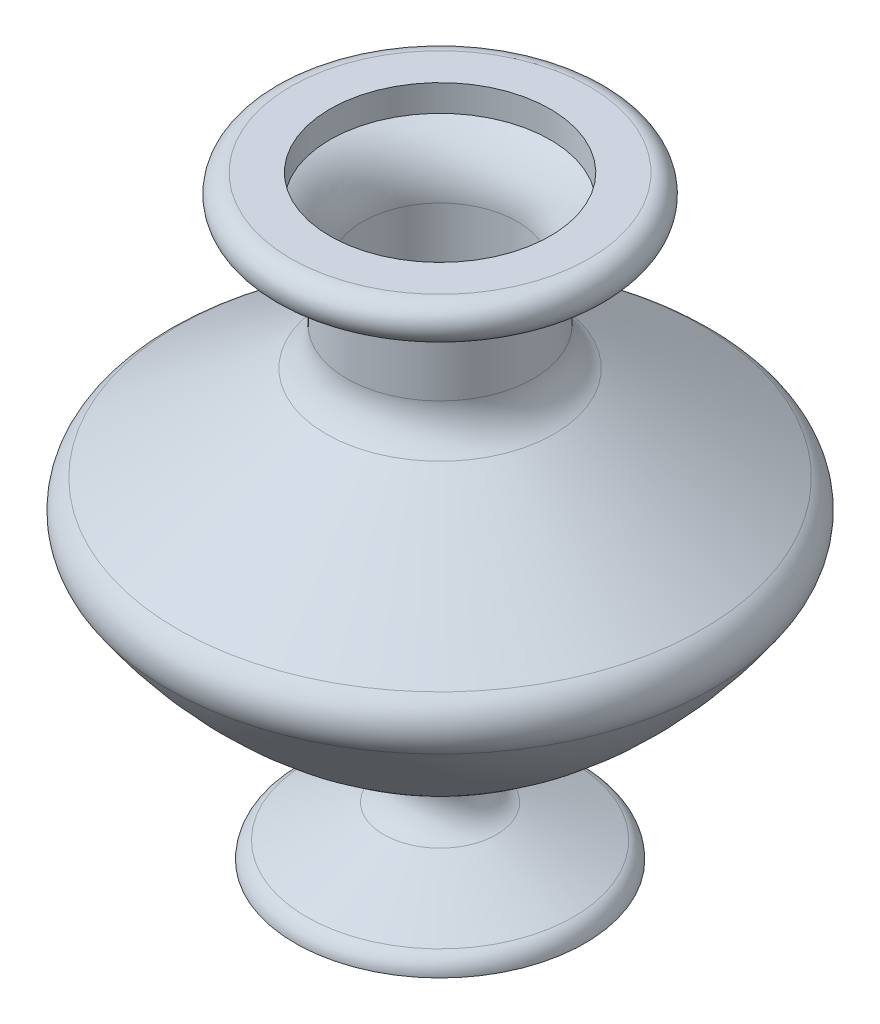
ISO-10303-21;
HEADER;
FILE_DESCRIPTION(('STEP AP214'),'2;1');
FILE_NAME('part.step','',(''),(''),'','','');
FILE_SCHEMA(('AUTOMOTIVE_DESIGN { 1 0 10303 214 1 1 1 1 }'));
ENDSEC;
DATA;
#1=APPLICATION_CONTEXT('core data for automotive mechanical design processes');
#2=APPLICATION_PROTOCOL_DEFINITION('international standard','automotive_design',2000,#1);
#3=PRODUCT_CONTEXT('',#1,'mechanical');
#4=PRODUCT('Part','Part','',(#3));
#5=PRODUCT_RELATED_PRODUCT_CATEGORY('part','',(#4));
#6=PRODUCT_DEFINITION_FORMATION('','',#4);
#7=PRODUCT_DEFINITION_CONTEXT('part definition',#1,'design');
#8=PRODUCT_DEFINITION('design','',#6,#7);
#9=PRODUCT_DEFINITION_SHAPE('','',#8);
#10=(LENGTH_UNIT() NAMED_UNIT(*) SI_UNIT(.MILLI.,.METRE.));
#11=(NAMED_UNIT(*) PLANE_ANGLE_UNIT() SI_UNIT($,.RADIAN.));
#12=(NAMED_UNIT(*) SI_UNIT($,.STERADIAN.) SOLID_ANGLE_UNIT());
#13=UNCERTAINTY_MEASURE_WITH_UNIT(LENGTH_MEASURE(1.E-05),#10,'distance_accuracy_value','');
#14=(GEOMETRIC_REPRESENTATION_CONTEXT(3) GLOBAL_UNCERTAINTY_ASSIGNED_CONTEXT((#13)) GLOBAL_UNIT_ASSIGNED_CONTEXT((#10,
#11,#12)) REPRESENTATION_CONTEXT('',''));
#15=CARTESIAN_POINT('',(0.,0.,0.));
#16=DIRECTION('',(0.,0.,1.));
#17=DIRECTION('',(1.,0.,0.));
#18=AXIS2_PLACEMENT_3D('',#15,#16,#17);
#19=CARTESIAN_POINT('',(0.,-80.,0.));
#20=DIRECTION('',(0.,-1.,0.));
#21=DIRECTION('',(1.,0.,0.));
#22=AXIS2_PLACEMENT_3D('',#19,#20,#21);
#23=PLANE('',#22);
#24=CARTESIAN_POINT('',(0.,-80.,0.));
#25=DIRECTION('',(0.,1.,0.));
#26=DIRECTION('',(-1.,0.,0.));
#27=AXIS2_PLACEMENT_3D('',#24,#25,#26);
#28=CIRCLE('',#27,38.905140273105);
#29=CARTESIAN_POINT('',(-38.9051402731049,-80.,0.));
#30=VERTEX_POINT('',#29);
#31=EDGE_CURVE('E10',#30,#30,#28,.T.);
#32=ORIENTED_EDGE('',*,*,#31,.F.);
#33=EDGE_LOOP('',(#32));
#34=FACE_BOUND('',#33,.T.);
#35=ADVANCED_FACE('F31',(#34),#23,.T.);
#36=CARTESIAN_POINT('',(0.,-79.9845651478144,0.));
#37=DIRECTION('',(0.,1.,0.));
#38=DIRECTION('',(-1.,0.,0.));
#39=AXIS2_PLACEMENT_3D('',#36,#37,#38);
#40=TOROIDAL_SURFACE('',#39,33.9051640966279,5.);
#41=ORIENTED_EDGE('',*,*,#31,.T.);
#42=EDGE_LOOP('',(#41));
#43=FACE_BOUND('',#42,.T.);
#44=CARTESIAN_POINT('',(0.,-75.3820478205228,0.));
#45=DIRECTION('',(0.,1.,0.));
#46=DIRECTION('',(-1.,0.,0.));
#47=AXIS2_PLACEMENT_3D('',#44,#45,#46);
#48=CIRCLE('',#47,35.8588360885397);
#49=CARTESIAN_POINT('',(-35.8588360885397,-75.3820478205229,0.));
#50=VERTEX_POINT('',#49);
#51=EDGE_CURVE('E37',#50,#50,#48,.T.);
#52=ORIENTED_EDGE('',*,*,#51,.F.);
#53=EDGE_LOOP('',(#52));
#54=FACE_BOUND('',#53,.T.);
#55=ADVANCED_FACE('F121',(#43,#54),#40,.T.);
#56=CARTESIAN_POINT('',(0.,-66.5845311891249,0.));
#57=DIRECTION('',(0.,-1.,0.));
#58=DIRECTION('',(1.,0.,0.));
#59=AXIS2_PLACEMENT_3D('',#56,#57,#58);
#60=CONICAL_SURFACE('',#59,15.1333904145588,1.16936704655124);
#61=ORIENTED_EDGE('',*,*,#51,.T.);
#62=EDGE_LOOP('',(#61));
#63=FACE_BOUND('',#62,.T.);
#64=CARTESIAN_POINT('',(0.,-66.5845311891249,0.));
#65=DIRECTION('',(0.,1.,0.));
#66=DIRECTION('',(-1.,0.,0.));
#67=AXIS2_PLACEMENT_3D('',#64,#65,#66);
#68=CIRCLE('',#67,15.1333904145588);
#69=CARTESIAN_POINT('',(-15.1333904145588,-66.5845311891249,0.));
#70=VERTEX_POINT('',#69);
#71=EDGE_CURVE('E41',#70,#70,#68,.T.);
#72=ORIENTED_EDGE('',*,*,#71,.F.);
#73=EDGE_LOOP('',(#72));
#74=FACE_BOUND('',#73,.T.);
#75=ADVANCED_FACE('F126',(#63,#74),#60,.T.);
#76=CARTESIAN_POINT('',(0.,-58.3,0.));
#77=DIRECTION('',(0.,1.,0.));
#78=DIRECTION('',(-1.,0.,0.));
#79=AXIS2_PLACEMENT_3D('',#76,#77,#78);
#80=TOROIDAL_SURFACE('',#79,18.65,9.00000000000002);
#81=ORIENTED_EDGE('',*,*,#71,.T.);
#82=EDGE_LOOP('',(#81));
#83=FACE_BOUND('',#82,.T.);
#84=CARTESIAN_POINT('',(0.,-49.9209340901695,0.));
#85=DIRECTION('',(0.,1.,0.));
#86=DIRECTION('',(-1.,0.,0.));
#87=AXIS2_PLACEMENT_3D('',#84,#85,#86);
#88=CIRCLE('',#87,15.3649955131359);
#89=CARTESIAN_POINT('',(-15.3649955131359,-49.9209340901695,0.));
#90=VERTEX_POINT('',#89);
#91=EDGE_CURVE('E45',#90,#90,#88,.T.);
#92=ORIENTED_EDGE('',*,*,#91,.F.);
#93=EDGE_LOOP('',(#92));
#94=FACE_BOUND('',#93,.T.);
#95=ADVANCED_FACE('F130',(#83,#94),#80,.F.);
#96=CARTESIAN_POINT('',(0.,66.2687798594792,0.));
#97=DIRECTION('',(0.,1.,0.));
#98=DIRECTION('',(-1.,0.,0.));
#99=AXIS2_PLACEMENT_3D('',#96,#97,#98);
#100=DEGENERATE_TOROIDAL_SURFACE('',#99,30.1870667047132,124.8,.F.);
#101=ORIENTED_EDGE('',*,*,#91,.T.);
#102=EDGE_LOOP('',(#101));
#103=FACE_BOUND('',#102,.T.);
#104=CARTESIAN_POINT('',(0.,-3.64161501498533,0.));
#105=DIRECTION('',(0.,1.,0.));
#106=DIRECTION('',(-1.,0.,0.));
#107=AXIS2_PLACEMENT_3D('',#104,#105,#106);
#108=CIRCLE('',#107,73.1936698398503);
#109=CARTESIAN_POINT('',(-73.1936698398503,-3.64161501498536,0.));
#110=VERTEX_POINT('',#109);
#111=EDGE_CURVE('E50',#110,#110,#108,.T.);
#112=ORIENTED_EDGE('',*,*,#111,.F.);
#113=EDGE_LOOP('',(#112));
#114=FACE_BOUND('',#113,.T.);
#115=ADVANCED_FACE('F136',(#103,#114),#100,.F.);
#116=CARTESIAN_POINT('',(0.,1.40000000000003,0.));
#117=DIRECTION('',(0.,1.,0.));
#118=DIRECTION('',(-1.,0.,0.));
#119=AXIS2_PLACEMENT_3D('',#116,#117,#118);
#120=TOROIDAL_SURFACE('',#119,65.7383282621173,8.99999999999998);
#121=ORIENTED_EDGE('',*,*,#111,.T.);
#122=EDGE_LOOP('',(#121));
#123=FACE_BOUND('',#122,.T.);
#124=CARTESIAN_POINT('',(0.,8.98837163590942,0.));
#125=DIRECTION('',(0.,1.,0.));
#126=DIRECTION('',(-1.,0.,0.));
#127=AXIS2_PLACEMENT_3D('',#124,#125,#126);
#128=CIRCLE('',#127,70.5774000651934);
#129=CARTESIAN_POINT('',(-70.5774000651934,8.9883716359094,0.));
#130=VERTEX_POINT('',#129);
#131=EDGE_CURVE('E53',#130,#130,#128,.T.);
#132=ORIENTED_EDGE('',*,*,#131,.F.);
#133=EDGE_LOOP('',(#132));
#134=FACE_BOUND('',#133,.T.);
#135=ADVANCED_FACE('F140',(#123,#134),#120,.T.);
#136=CARTESIAN_POINT('',(0.,34.4489706214393,0.));
#137=DIRECTION('',(0.,-1.,0.));
#138=DIRECTION('',(1.,0.,0.));
#139=AXIS2_PLACEMENT_3D('',#136,#137,#138);
#140=CONICAL_SURFACE('',#139,30.6514607451271,1.00311958027937);
#141=ORIENTED_EDGE('',*,*,#131,.T.);
#142=EDGE_LOOP('',(#141));
#143=FACE_BOUND('',#142,.T.);
#144=CARTESIAN_POINT('',(0.,34.4489706214393,0.));
#145=DIRECTION('',(0.,1.,0.));
#146=DIRECTION('',(-1.,0.,0.));
#147=AXIS2_PLACEMENT_3D('',#144,#145,#146);
#148=CIRCLE('',#147,30.6514607451271);
#149=CARTESIAN_POINT('',(-30.6514607451271,34.4489706214393,0.));
#150=VERTEX_POINT('',#149);
#151=EDGE_CURVE('E56',#150,#150,#148,.T.);
#152=ORIENTED_EDGE('',*,*,#151,.F.);
#153=EDGE_LOOP('',(#152));
#154=FACE_BOUND('',#153,.T.);
#155=ADVANCED_FACE('F144',(#143,#154),#140,.T.);
#156=CARTESIAN_POINT('',(0.,44.5667994693185,0.));
#157=DIRECTION('',(0.,1.,0.));
#158=DIRECTION('',(-1.,0.,0.));
#159=AXIS2_PLACEMENT_3D('',#156,#157,#158);
#160=TOROIDAL_SURFACE('',#159,37.1035564825618,12.);
#161=ORIENTED_EDGE('',*,*,#151,.T.);
#162=EDGE_LOOP('',(#161));
#163=FACE_BOUND('',#162,.T.);
#164=CARTESIAN_POINT('',(0.,44.5667994693185,0.));
#165=DIRECTION('',(0.,1.,0.));
#166=DIRECTION('',(-1.,0.,0.));
#167=AXIS2_PLACEMENT_3D('',#164,#165,#166);
#168=CIRCLE('',#167,25.1035564825618);
#169=CARTESIAN_POINT('',(-25.1035564825618,44.5667994693185,0.));
#170=VERTEX_POINT('',#169);
#171=EDGE_CURVE('E59',#170,#170,#168,.T.);
#172=ORIENTED_EDGE('',*,*,#171,.F.);
#173=EDGE_LOOP('',(#172));
#174=FACE_BOUND('',#173,.T.);
#175=ADVANCED_FACE('F148',(#163,#174),#160,.F.);
#176=CARTESIAN_POINT('',(0.,80.,0.));
#177=DIRECTION('',(0.,1.,0.));
#178=DIRECTION('',(-1.,0.,0.));
#179=AXIS2_PLACEMENT_3D('',#176,#177,#178);
#180=CYLINDRICAL_SURFACE('',#179,25.1035564825618);
#181=ORIENTED_EDGE('',*,*,#171,.T.);
#182=EDGE_LOOP('',(#181));
#183=FACE_BOUND('',#182,.T.);
#184=CARTESIAN_POINT('',(0.,58.2667994693185,0.));
#185=DIRECTION('',(0.,1.,0.));
#186=DIRECTION('',(-1.,0.,0.));
#187=AXIS2_PLACEMENT_3D('',#184,#185,#186);
#188=CIRCLE('',#187,25.1035564825618);
#189=CARTESIAN_POINT('',(-25.1035564825618,58.2667994693185,0.));
#190=VERTEX_POINT('',#189);
#191=EDGE_CURVE('E62',#190,#190,#188,.T.);
#192=ORIENTED_EDGE('',*,*,#191,.F.);
#193=EDGE_LOOP('',(#192));
#194=FACE_BOUND('',#193,.T.);
#195=ADVANCED_FACE('F152',(#183,#194),#180,.T.);
#196=CARTESIAN_POINT('',(0.,58.2667994693185,0.));
#197=DIRECTION('',(0.,1.,0.));
#198=DIRECTION('',(-1.,0.,0.));
#199=AXIS2_PLACEMENT_3D('',#196,#197,#198);
#200=TOROIDAL_SURFACE('',#199,37.1035564825618,12.);
#201=ORIENTED_EDGE('',*,*,#191,.T.);
#202=EDGE_LOOP('',(#201));
#203=FACE_BOUND('',#202,.T.);
#204=CARTESIAN_POINT('',(0.,70.0784704321525,0.));
#205=DIRECTION('',(0.,1.,0.));
#206=DIRECTION('',(-1.,0.,0.));
#207=AXIS2_PLACEMENT_3D('',#204,#205,#206);
#208=CIRCLE('',#207,39.2212035413854);
#209=CARTESIAN_POINT('',(-39.2212035413854,70.0784704321525,0.));
#210=VERTEX_POINT('',#209);
#211=EDGE_CURVE('E65',#210,#210,#208,.T.);
#212=ORIENTED_EDGE('',*,*,#211,.F.);
#213=EDGE_LOOP('',(#212));
#214=FACE_BOUND('',#213,.T.);
#215=ADVANCED_FACE('F156',(#203,#214),#200,.F.);
#216=CARTESIAN_POINT('',(0.,75.,0.));
#217=DIRECTION('',(0.,1.,0.));
#218=DIRECTION('',(-1.,0.,0.));
#219=AXIS2_PLACEMENT_3D('',#216,#217,#218);
#220=TOROIDAL_SURFACE('',#219,40.1035564825618,5.);
#221=ORIENTED_EDGE('',*,*,#211,.T.);
#222=EDGE_LOOP('',(#221));
#223=FACE_BOUND('',#222,.T.);
#224=CARTESIAN_POINT('',(0.,80.,0.));
#225=DIRECTION('',(0.,1.,0.));
#226=DIRECTION('',(-1.,0.,0.));
#227=AXIS2_PLACEMENT_3D('',#224,#225,#226);
#228=CIRCLE('',#227,40.1035564825618);
#229=CARTESIAN_POINT('',(-40.1035564825619,80.,0.));
#230=VERTEX_POINT('',#229);
#231=EDGE_CURVE('E68',#230,#230,#228,.T.);
#232=ORIENTED_EDGE('',*,*,#231,.F.);
#233=EDGE_LOOP('',(#232));
#234=FACE_BOUND('',#233,.T.);
#235=ADVANCED_FACE('F160',(#223,#234),#220,.T.);
#236=CARTESIAN_POINT('',(-40.1035564825619,80.,0.));
#237=DIRECTION('',(0.,1.,0.));
#238=DIRECTION('',(-1.,0.,0.));
#239=AXIS2_PLACEMENT_3D('',#236,#237,#238);
#240=PLANE('',#239);
#241=ORIENTED_EDGE('',*,*,#231,.T.);
#242=EDGE_LOOP('',(#241));
#243=FACE_BOUND('',#242,.T.);
#244=CARTESIAN_POINT('',(0.,80.,0.));
#245=DIRECTION('',(0.,1.,0.));
#246=DIRECTION('',(-1.,0.,0.));
#247=AXIS2_PLACEMENT_3D('',#244,#245,#246);
#248=CIRCLE('',#247,29.6035564825618);
#249=CARTESIAN_POINT('',(-29.6035564825619,80.,0.));
#250=VERTEX_POINT('',#249);
#251=EDGE_CURVE('E71',#250,#250,#248,.T.);
#252=ORIENTED_EDGE('',*,*,#251,.F.);
#253=EDGE_LOOP('',(#252));
#254=FACE_BOUND('',#253,.T.);
#255=ADVANCED_FACE('F164',(#243,#254),#240,.T.);
#256=CARTESIAN_POINT('',(0.,80.,0.));
#257=DIRECTION('',(0.,1.,0.));
#258=DIRECTION('',(-1.,0.,0.));
#259=AXIS2_PLACEMENT_3D('',#256,#257,#258);
#260=CYLINDRICAL_SURFACE('',#259,29.6035564825618);
#261=ORIENTED_EDGE('',*,*,#251,.T.);
#262=EDGE_LOOP('',(#261));
#263=FACE_BOUND('',#262,.T.);
#264=CARTESIAN_POINT('',(0.,72.8513803683365,0.));
#265=DIRECTION('',(0.,1.,0.));
#266=DIRECTION('',(-1.,0.,0.));
#267=AXIS2_PLACEMENT_3D('',#264,#265,#266);
#268=CIRCLE('',#267,29.6035564825618);
#269=CARTESIAN_POINT('',(-29.6035564825619,72.8513803683365,0.));
#270=VERTEX_POINT('',#269);
#271=EDGE_CURVE('E74',#270,#270,#268,.T.);
#272=ORIENTED_EDGE('',*,*,#271,.F.);
#273=EDGE_LOOP('',(#272));
#274=FACE_BOUND('',#273,.T.);
#275=ADVANCED_FACE('F168',(#263,#274),#260,.F.);
#276=CARTESIAN_POINT('',(0.,58.2667994693185,0.));
#277=DIRECTION('',(0.,1.,0.));
#278=DIRECTION('',(-1.,0.,0.));
#279=AXIS2_PLACEMENT_3D('',#276,#277,#278);
#280=TOROIDAL_SURFACE('',#279,37.1035564825618,16.4);
#281=ORIENTED_EDGE('',*,*,#271,.T.);
#282=EDGE_LOOP('',(#281));
#283=FACE_BOUND('',#282,.T.);
#284=CARTESIAN_POINT('',(0.,58.2667994693185,0.));
#285=DIRECTION('',(0.,1.,0.));
#286=DIRECTION('',(-1.,0.,0.));
#287=AXIS2_PLACEMENT_3D('',#284,#285,#286);
#288=CIRCLE('',#287,20.7035564825618);
#289=CARTESIAN_POINT('',(-20.7035564825619,58.2667994693185,0.));
#290=VERTEX_POINT('',#289);
#291=EDGE_CURVE('E77',#290,#290,#288,.T.);
#292=ORIENTED_EDGE('',*,*,#291,.F.);
#293=EDGE_LOOP('',(#292));
#294=FACE_BOUND('',#293,.T.);
#295=ADVANCED_FACE('F172',(#283,#294),#280,.T.);
#296=CARTESIAN_POINT('',(0.,80.,0.));
#297=DIRECTION('',(0.,1.,0.));
#298=DIRECTION('',(-1.,0.,0.));
#299=AXIS2_PLACEMENT_3D('',#296,#297,#298);
#300=CYLINDRICAL_SURFACE('',#299,20.7035564825618);
#301=ORIENTED_EDGE('',*,*,#291,.T.);
#302=EDGE_LOOP('',(#301));
#303=FACE_BOUND('',#302,.T.);
#304=CARTESIAN_POINT('',(0.,44.5667994693185,0.));
#305=DIRECTION('',(0.,1.,0.));
#306=DIRECTION('',(-1.,0.,0.));
#307=AXIS2_PLACEMENT_3D('',#304,#305,#306);
#308=CIRCLE('',#307,20.7035564825618);
#309=CARTESIAN_POINT('',(-20.7035564825619,44.5667994693185,0.));
#310=VERTEX_POINT('',#309);
#311=EDGE_CURVE('E80',#310,#310,#308,.T.);
#312=ORIENTED_EDGE('',*,*,#311,.F.);
#313=EDGE_LOOP('',(#312));
#314=FACE_BOUND('',#313,.T.);
#315=ADVANCED_FACE('F176',(#303,#314),#300,.F.);
#316=CARTESIAN_POINT('',(0.,44.5667994693185,0.));
#317=DIRECTION('',(0.,1.,0.));
#318=DIRECTION('',(-1.,0.,0.));
#319=AXIS2_PLACEMENT_3D('',#316,#317,#318);
#320=TOROIDAL_SURFACE('',#319,37.1035564825618,16.4);
#321=ORIENTED_EDGE('',*,*,#311,.T.);
#322=EDGE_LOOP('',(#321));
#323=FACE_BOUND('',#322,.T.);
#324=CARTESIAN_POINT('',(0.,30.7391000438836,0.));
#325=DIRECTION('',(0.,1.,0.));
#326=DIRECTION('',(-1.,0.,0.));
#327=AXIS2_PLACEMENT_3D('',#324,#325,#326);
#328=CIRCLE('',#327,28.2856923080677);
#329=CARTESIAN_POINT('',(-28.2856923080677,30.7391000438836,0.));
#330=VERTEX_POINT('',#329);
#331=EDGE_CURVE('E83',#330,#330,#328,.T.);
#332=ORIENTED_EDGE('',*,*,#331,.F.);
#333=EDGE_LOOP('',(#332));
#334=FACE_BOUND('',#333,.T.);
#335=ADVANCED_FACE('F180',(#323,#334),#320,.T.);
#336=CARTESIAN_POINT('',(0.,5.27850105835369,0.));
#337=DIRECTION('',(0.,-1.,0.));
#338=DIRECTION('',(1.,0.,0.));
#339=AXIS2_PLACEMENT_3D('',#336,#337,#338);
#340=CONICAL_SURFACE('',#339,68.211631628134,1.00311958027936);
#341=ORIENTED_EDGE('',*,*,#331,.T.);
#342=EDGE_LOOP('',(#341));
#343=FACE_BOUND('',#342,.T.);
#344=CARTESIAN_POINT('',(0.,5.27850105835369,0.));
#345=DIRECTION('',(0.,1.,0.));
#346=DIRECTION('',(-1.,0.,0.));
#347=AXIS2_PLACEMENT_3D('',#344,#345,#346);
#348=CIRCLE('',#347,68.211631628134);
#349=CARTESIAN_POINT('',(-68.211631628134,5.27850105835367,0.));
#350=VERTEX_POINT('',#349);
#351=EDGE_CURVE('E86',#350,#350,#348,.T.);
#352=ORIENTED_EDGE('',*,*,#351,.F.);
#353=EDGE_LOOP('',(#352));
#354=FACE_BOUND('',#353,.T.);
#355=ADVANCED_FACE('F184',(#343,#354),#340,.F.);
#356=CARTESIAN_POINT('',(0.,1.40000000000003,0.));
#357=DIRECTION('',(0.,1.,0.));
#358=DIRECTION('',(-1.,0.,0.));
#359=AXIS2_PLACEMENT_3D('',#356,#357,#358);
#360=TOROIDAL_SURFACE('',#359,65.7383282621173,4.59999999999998);
#361=ORIENTED_EDGE('',*,*,#351,.T.);
#362=EDGE_LOOP('',(#361));
#363=FACE_BOUND('',#362,.T.);
#364=CARTESIAN_POINT('',(0.,-1.17682545210362,0.));
#365=DIRECTION('',(0.,1.,0.));
#366=DIRECTION('',(-1.,0.,0.));
#367=AXIS2_PLACEMENT_3D('',#364,#365,#366);
#368=CIRCLE('',#367,69.5488361796253);
#369=CARTESIAN_POINT('',(-69.5488361796253,-1.17682545210365,0.));
#370=VERTEX_POINT('',#369);
#371=EDGE_CURVE('E89',#370,#370,#368,.T.);
#372=ORIENTED_EDGE('',*,*,#371,.F.);
#373=EDGE_LOOP('',(#372));
#374=FACE_BOUND('',#373,.T.);
#375=ADVANCED_FACE('F188',(#363,#374),#360,.F.);
#376=CARTESIAN_POINT('',(0.,66.2687798594792,0.));
#377=DIRECTION('',(0.,1.,0.));
#378=DIRECTION('',(-1.,0.,0.));
#379=AXIS2_PLACEMENT_3D('',#376,#377,#378);
#380=DEGENERATE_TOROIDAL_SURFACE('',#379,30.1870667047132,120.4,.F.);
#381=ORIENTED_EDGE('',*,*,#371,.T.);
#382=EDGE_LOOP('',(#381));
#383=FACE_BOUND('',#382,.T.);
#384=CARTESIAN_POINT('',(0.,-45.8245018675858,0.));
#385=DIRECTION('',(0.,1.,0.));
#386=DIRECTION('',(-1.,0.,0.));
#387=AXIS2_PLACEMENT_3D('',#384,#385,#386);
#388=CIRCLE('',#387,13.7589933195579);
#389=CARTESIAN_POINT('',(-13.7589933195579,-45.8245018675858,0.));
#390=VERTEX_POINT('',#389);
#391=EDGE_CURVE('E92',#390,#390,#388,.T.);
#392=ORIENTED_EDGE('',*,*,#391,.F.);
#393=EDGE_LOOP('',(#392));
#394=FACE_BOUND('',#393,.T.);
#395=ADVANCED_FACE('F192',(#383,#394),#380,.T.);
#396=CARTESIAN_POINT('',(0.,-58.3,0.));
#397=DIRECTION('',(0.,1.,0.));
#398=DIRECTION('',(-1.,0.,0.));
#399=AXIS2_PLACEMENT_3D('',#396,#397,#398);
#400=TOROIDAL_SURFACE('',#399,18.65,13.4);
#401=ORIENTED_EDGE('',*,*,#391,.T.);
#402=EDGE_LOOP('',(#401));
#403=FACE_BOUND('',#402,.T.);
#404=CARTESIAN_POINT('',(0.,-70.6347464371415,0.));
#405=DIRECTION('',(0.,1.,0.));
#406=DIRECTION('',(-1.,0.,0.));
#407=AXIS2_PLACEMENT_3D('',#404,#405,#406);
#408=CIRCLE('',#407,13.4141590616765);
#409=CARTESIAN_POINT('',(-13.4141590616765,-70.6347464371415,0.));
#410=VERTEX_POINT('',#409);
#411=EDGE_CURVE('E95',#410,#410,#408,.T.);
#412=ORIENTED_EDGE('',*,*,#411,.F.);
#413=EDGE_LOOP('',(#412));
#414=FACE_BOUND('',#413,.T.);
#415=ADVANCED_FACE('F117',(#403,#414),#400,.T.);
#416=CARTESIAN_POINT('',(0.,-75.3149973325402,0.));
#417=DIRECTION('',(0.,-1.,0.));
#418=DIRECTION('',(1.,0.,0.));
#419=AXIS2_PLACEMENT_3D('',#416,#417,#418);
#420=CONICAL_SURFACE('',#419,24.4400303089095,1.16936704655124);
#421=ORIENTED_EDGE('',*,*,#411,.T.);
#422=EDGE_LOOP('',(#421));
#423=FACE_BOUND('',#422,.T.);
#424=CARTESIAN_POINT('',(0.,-75.3149973325402,0.));
#425=DIRECTION('',(0.,1.,0.));
#426=DIRECTION('',(-1.,0.,0.));
#427=AXIS2_PLACEMENT_3D('',#424,#425,#426);
#428=CIRCLE('',#427,24.4400303089095);
#429=CARTESIAN_POINT('',(-24.4400303089095,-75.3149973325402,0.));
#430=VERTEX_POINT('',#429);
#431=EDGE_CURVE('E98',#430,#430,#428,.T.);
#432=ORIENTED_EDGE('',*,*,#431,.F.);
#433=EDGE_LOOP('',(#432));
#434=FACE_BOUND('',#433,.T.);
#435=ADVANCED_FACE('F109',(#423,#434),#420,.F.);
#436=CARTESIAN_POINT('',(0.,-75.4896608372728,0.));
#437=DIRECTION('',(0.,1.,0.));
#438=DIRECTION('',(-1.,0.,0.));
#439=AXIS2_PLACEMENT_3D('',#436,#437,#438);
#440=TOROIDAL_SURFACE('',#439,24.3388592356008,0.20184877002331);
#441=ORIENTED_EDGE('',*,*,#431,.T.);
#442=EDGE_LOOP('',(#441));
#443=FACE_BOUND('',#442,.T.);
#444=CARTESIAN_POINT('',(0.,-75.6,0.));
#445=DIRECTION('',(0.,1.,0.));
#446=DIRECTION('',(-1.,0.,0.));
#447=AXIS2_PLACEMENT_3D('',#444,#445,#446);
#448=CIRCLE('',#447,24.507880521623);
#449=CARTESIAN_POINT('',(-24.507880521623,-75.6,0.));
#450=VERTEX_POINT('',#449);
#451=EDGE_CURVE('E101',#450,#450,#448,.T.);
#452=ORIENTED_EDGE('',*,*,#451,.F.);
#453=EDGE_LOOP('',(#452));
#454=FACE_BOUND('',#453,.T.);
#455=ADVANCED_FACE('F107',(#443,#454),#440,.F.);
#456=CARTESIAN_POINT('',(0.,-75.6,0.));
#457=DIRECTION('',(0.,1.,0.));
#458=DIRECTION('',(-1.,0.,0.));
#459=AXIS2_PLACEMENT_3D('',#456,#457,#458);
#460=PLANE('',#459);
#461=ORIENTED_EDGE('',*,*,#451,.T.);
#462=EDGE_LOOP('',(#461));
#463=FACE_BOUND('',#462,.T.);
#464=ADVANCED_FACE('F105',(#463),#460,.T.);
#465=CLOSED_SHELL('',(#35,#55,#75,#95,#115,#135,#155,#175,#195,#215,#235,#255,#275,#295,#315,
#335,#355,#375,#395,#415,#435,#455,#464));
#466=MANIFOLD_SOLID_BREP('B2',#465);
#467=ADVANCED_BREP_SHAPE_REPRESENTATION('',(#18,#466),#14);
#468=SHAPE_DEFINITION_REPRESENTATION(#9,#467);
ENDSEC;
END-ISO-10303-21;
